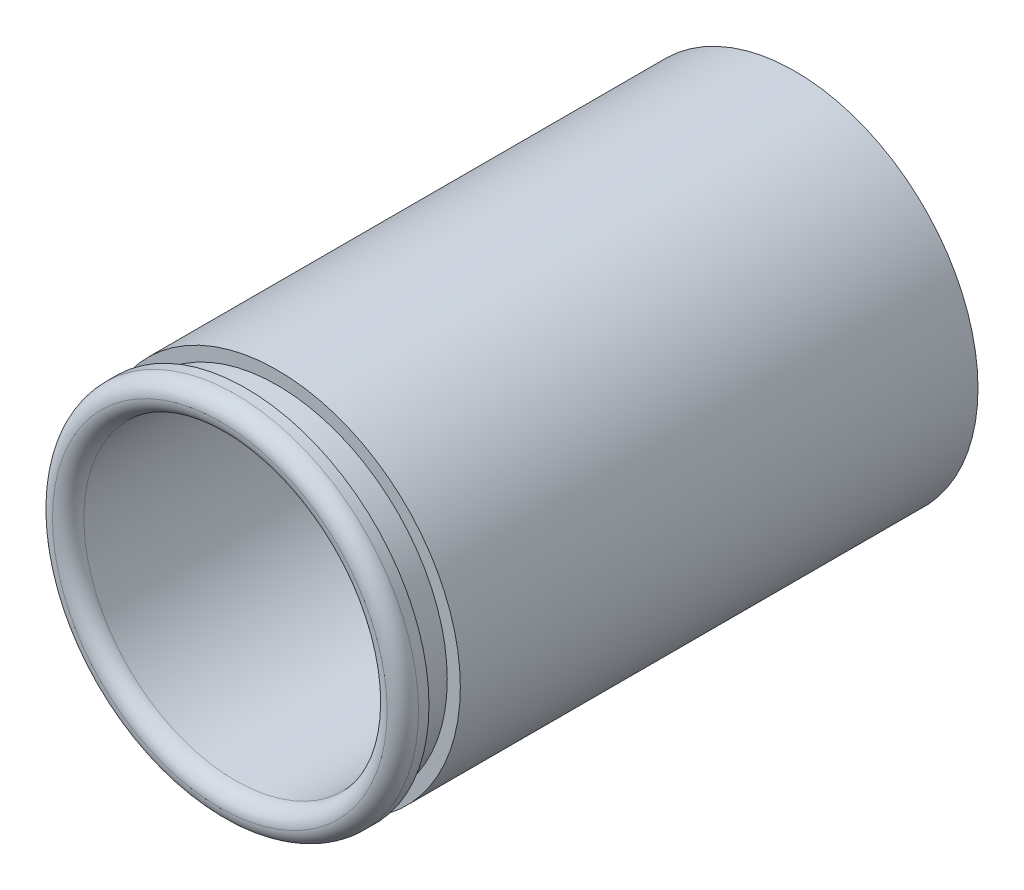
ISO-10303-21;
HEADER;
FILE_DESCRIPTION(('STEP AP214'),'2;1');
FILE_NAME('part.step','',(''),(''),'','','');
FILE_SCHEMA(('AUTOMOTIVE_DESIGN { 1 0 10303 214 1 1 1 1 }'));
ENDSEC;
DATA;
#1=APPLICATION_CONTEXT('core data for automotive mechanical design processes');
#2=APPLICATION_PROTOCOL_DEFINITION('international standard','automotive_design',2000,#1);
#3=PRODUCT_CONTEXT('',#1,'mechanical');
#4=PRODUCT('Part','Part','',(#3));
#5=PRODUCT_RELATED_PRODUCT_CATEGORY('part','',(#4));
#6=PRODUCT_DEFINITION_FORMATION('','',#4);
#7=PRODUCT_DEFINITION_CONTEXT('part definition',#1,'design');
#8=PRODUCT_DEFINITION('design','',#6,#7);
#9=PRODUCT_DEFINITION_SHAPE('','',#8);
#10=(LENGTH_UNIT() NAMED_UNIT(*) SI_UNIT(.MILLI.,.METRE.));
#11=(NAMED_UNIT(*) PLANE_ANGLE_UNIT() SI_UNIT($,.RADIAN.));
#12=(NAMED_UNIT(*) SI_UNIT($,.STERADIAN.) SOLID_ANGLE_UNIT());
#13=UNCERTAINTY_MEASURE_WITH_UNIT(LENGTH_MEASURE(1.E-05),#10,'distance_accuracy_value','');
#14=(GEOMETRIC_REPRESENTATION_CONTEXT(3) GLOBAL_UNCERTAINTY_ASSIGNED_CONTEXT((#13)) GLOBAL_UNIT_ASSIGNED_CONTEXT((#10,
#11,#12)) REPRESENTATION_CONTEXT('',''));
#15=CARTESIAN_POINT('',(0.,0.,0.));
#16=DIRECTION('',(0.,0.,1.));
#17=DIRECTION('',(1.,0.,0.));
#18=AXIS2_PLACEMENT_3D('',#15,#16,#17);
#19=CARTESIAN_POINT('',(0.,0.,11.));
#20=DIRECTION('',(0.,0.,-1.));
#21=DIRECTION('',(-1.,0.,0.));
#22=AXIS2_PLACEMENT_3D('',#19,#20,#21);
#23=CYLINDRICAL_SURFACE('',#22,3.5);
#24=CARTESIAN_POINT('',(0.,0.,10.7));
#25=DIRECTION('',(0.,0.,1.));
#26=DIRECTION('',(1.,0.,0.));
#27=AXIS2_PLACEMENT_3D('',#24,#25,#26);
#28=CIRCLE('',#27,3.5);
#29=CARTESIAN_POINT('',(3.5,0.,10.7));
#30=VERTEX_POINT('',#29);
#31=EDGE_CURVE('E10',#30,#30,#28,.F.);
#32=ORIENTED_EDGE('',*,*,#31,.T.);
#33=EDGE_LOOP('',(#32));
#34=FACE_BOUND('',#33,.T.);
#35=CARTESIAN_POINT('',(0.,0.,10.5));
#36=DIRECTION('',(0.,0.,1.));
#37=DIRECTION('',(1.,0.,0.));
#38=AXIS2_PLACEMENT_3D('',#35,#36,#37);
#39=CIRCLE('',#38,3.5);
#40=CARTESIAN_POINT('',(3.5,0.,10.5));
#41=VERTEX_POINT('',#40);
#42=EDGE_CURVE('E59',#41,#41,#39,.T.);
#43=ORIENTED_EDGE('',*,*,#42,.T.);
#44=EDGE_LOOP('',(#43));
#45=FACE_BOUND('',#44,.T.);
#46=ADVANCED_FACE('F31',(#34,#45),#23,.T.);
#47=CARTESIAN_POINT('',(0.,0.,0.));
#48=DIRECTION('',(0.,0.,1.));
#49=DIRECTION('',(1.,0.,0.));
#50=AXIS2_PLACEMENT_3D('',#47,#48,#49);
#51=CIRCLE('',#50,3.5);
#52=CARTESIAN_POINT('',(3.5,0.,0.));
#53=VERTEX_POINT('',#52);
#54=EDGE_CURVE('E41',#53,#53,#51,.T.);
#55=ORIENTED_EDGE('',*,*,#54,.T.);
#56=EDGE_LOOP('',(#55));
#57=FACE_BOUND('',#56,.T.);
#58=CARTESIAN_POINT('',(0.,0.,9.9));
#59=DIRECTION('',(0.,0.,1.));
#60=DIRECTION('',(1.,0.,0.));
#61=AXIS2_PLACEMENT_3D('',#58,#59,#60);
#62=CIRCLE('',#61,3.5);
#63=CARTESIAN_POINT('',(3.5,0.,9.9));
#64=VERTEX_POINT('',#63);
#65=EDGE_CURVE('E56',#64,#64,#62,.T.);
#66=ORIENTED_EDGE('',*,*,#65,.F.);
#67=EDGE_LOOP('',(#66));
#68=FACE_BOUND('',#67,.T.);
#69=ADVANCED_FACE('F83',(#57,#68),#23,.T.);
#70=CARTESIAN_POINT('',(0.,0.,0.));
#71=DIRECTION('',(0.,0.,1.));
#72=DIRECTION('',(1.,0.,0.));
#73=AXIS2_PLACEMENT_3D('',#70,#71,#72);
#74=PLANE('',#73);
#75=ORIENTED_EDGE('',*,*,#54,.F.);
#76=EDGE_LOOP('',(#75));
#77=FACE_BOUND('',#76,.T.);
#78=CARTESIAN_POINT('',(0.,0.,0.));
#79=DIRECTION('',(0.,0.,1.));
#80=DIRECTION('',(1.,0.,0.));
#81=AXIS2_PLACEMENT_3D('',#78,#79,#80);
#82=CIRCLE('',#81,2.9);
#83=CARTESIAN_POINT('',(2.9,0.,0.));
#84=VERTEX_POINT('',#83);
#85=EDGE_CURVE('E45',#84,#84,#82,.T.);
#86=ORIENTED_EDGE('',*,*,#85,.T.);
#87=EDGE_LOOP('',(#86));
#88=FACE_BOUND('',#87,.T.);
#89=ADVANCED_FACE('F87',(#77,#88),#74,.F.);
#90=CARTESIAN_POINT('',(0.,0.,11.));
#91=DIRECTION('',(0.,0.,-1.));
#92=DIRECTION('',(-1.,0.,0.));
#93=AXIS2_PLACEMENT_3D('',#90,#91,#92);
#94=CYLINDRICAL_SURFACE('',#93,2.9);
#95=CARTESIAN_POINT('',(0.,0.,10.7));
#96=DIRECTION('',(0.,0.,1.));
#97=DIRECTION('',(1.,0.,0.));
#98=AXIS2_PLACEMENT_3D('',#95,#96,#97);
#99=CIRCLE('',#98,2.9);
#100=CARTESIAN_POINT('',(2.9,0.,10.7));
#101=VERTEX_POINT('',#100);
#102=EDGE_CURVE('E37',#101,#101,#99,.T.);
#103=ORIENTED_EDGE('',*,*,#102,.T.);
#104=EDGE_LOOP('',(#103));
#105=FACE_BOUND('',#104,.T.);
#106=ORIENTED_EDGE('',*,*,#85,.F.);
#107=EDGE_LOOP('',(#106));
#108=FACE_BOUND('',#107,.T.);
#109=ADVANCED_FACE('F94',(#105,#108),#94,.F.);
#110=CARTESIAN_POINT('',(0.,3.5,10.5));
#111=DIRECTION('',(0.,0.,-1.));
#112=DIRECTION('',(-1.,0.,0.));
#113=AXIS2_PLACEMENT_3D('',#110,#111,#112);
#114=PLANE('',#113);
#115=CARTESIAN_POINT('',(0.,0.,10.5));
#116=DIRECTION('',(0.,0.,1.));
#117=DIRECTION('',(1.,0.,0.));
#118=AXIS2_PLACEMENT_3D('',#115,#116,#117);
#119=CIRCLE('',#118,3.25);
#120=CARTESIAN_POINT('',(3.25,0.,10.5));
#121=VERTEX_POINT('',#120);
#122=EDGE_CURVE('E50',#121,#121,#119,.T.);
#123=ORIENTED_EDGE('',*,*,#122,.T.);
#124=EDGE_LOOP('',(#123));
#125=FACE_BOUND('',#124,.T.);
#126=ORIENTED_EDGE('',*,*,#42,.F.);
#127=EDGE_LOOP('',(#126));
#128=FACE_BOUND('',#127,.T.);
#129=ADVANCED_FACE('F92',(#125,#128),#114,.T.);
#130=CARTESIAN_POINT('',(0.,0.,10.));
#131=DIRECTION('',(0.,0.,1.));
#132=DIRECTION('',(1.,0.,0.));
#133=AXIS2_PLACEMENT_3D('',#130,#131,#132);
#134=CYLINDRICAL_SURFACE('',#133,3.25);
#135=CARTESIAN_POINT('',(0.,0.,9.9));
#136=DIRECTION('',(0.,0.,1.));
#137=DIRECTION('',(1.,0.,0.));
#138=AXIS2_PLACEMENT_3D('',#135,#136,#137);
#139=CIRCLE('',#138,3.25);
#140=CARTESIAN_POINT('',(3.25,0.,9.9));
#141=VERTEX_POINT('',#140);
#142=EDGE_CURVE('E53',#141,#141,#139,.T.);
#143=ORIENTED_EDGE('',*,*,#142,.T.);
#144=EDGE_LOOP('',(#143));
#145=FACE_BOUND('',#144,.T.);
#146=ORIENTED_EDGE('',*,*,#122,.F.);
#147=EDGE_LOOP('',(#146));
#148=FACE_BOUND('',#147,.T.);
#149=ADVANCED_FACE('F79',(#145,#148),#134,.T.);
#150=CARTESIAN_POINT('',(0.,3.5,9.9));
#151=DIRECTION('',(0.,0.,1.));
#152=DIRECTION('',(1.,0.,0.));
#153=AXIS2_PLACEMENT_3D('',#150,#151,#152);
#154=PLANE('',#153);
#155=ORIENTED_EDGE('',*,*,#65,.T.);
#156=EDGE_LOOP('',(#155));
#157=FACE_BOUND('',#156,.T.);
#158=ORIENTED_EDGE('',*,*,#142,.F.);
#159=EDGE_LOOP('',(#158));
#160=FACE_BOUND('',#159,.T.);
#161=ADVANCED_FACE('F71',(#157,#160),#154,.T.);
#162=CARTESIAN_POINT('',(0.,0.,10.7));
#163=DIRECTION('',(0.,0.,1.));
#164=DIRECTION('',(1.,0.,0.));
#165=AXIS2_PLACEMENT_3D('',#162,#163,#164);
#166=TOROIDAL_SURFACE('',#165,3.2,0.3);
#167=ORIENTED_EDGE('',*,*,#31,.F.);
#168=EDGE_LOOP('',(#167));
#169=FACE_BOUND('',#168,.T.);
#170=CARTESIAN_POINT('',(0.,0.,11.));
#171=DIRECTION('',(0.,0.,1.));
#172=DIRECTION('',(1.,0.,0.));
#173=AXIS2_PLACEMENT_3D('',#170,#171,#172);
#174=CIRCLE('',#173,3.2);
#175=CARTESIAN_POINT('',(3.2,0.,11.));
#176=VERTEX_POINT('',#175);
#177=EDGE_CURVE('E62',#176,#176,#174,.T.);
#178=ORIENTED_EDGE('',*,*,#177,.F.);
#179=EDGE_LOOP('',(#178));
#180=FACE_BOUND('',#179,.T.);
#181=ADVANCED_FACE('F69',(#169,#180),#166,.T.);
#182=CARTESIAN_POINT('',(0.,0.,10.7));
#183=DIRECTION('',(0.,0.,1.));
#184=DIRECTION('',(1.,0.,0.));
#185=AXIS2_PLACEMENT_3D('',#182,#183,#184);
#186=TOROIDAL_SURFACE('',#185,3.2,0.3);
#187=ORIENTED_EDGE('',*,*,#177,.T.);
#188=EDGE_LOOP('',(#187));
#189=FACE_BOUND('',#188,.T.);
#190=ORIENTED_EDGE('',*,*,#102,.F.);
#191=EDGE_LOOP('',(#190));
#192=FACE_BOUND('',#191,.T.);
#193=ADVANCED_FACE('F66',(#189,#192),#186,.T.);
#194=CLOSED_SHELL('',(#46,#69,#89,#109,#129,#149,#161,#181,#193));
#195=MANIFOLD_SOLID_BREP('B2',#194);
#196=ADVANCED_BREP_SHAPE_REPRESENTATION('',(#18,#195),#14);
#197=SHAPE_DEFINITION_REPRESENTATION(#9,#196);
ENDSEC;
END-ISO-10303-21;
